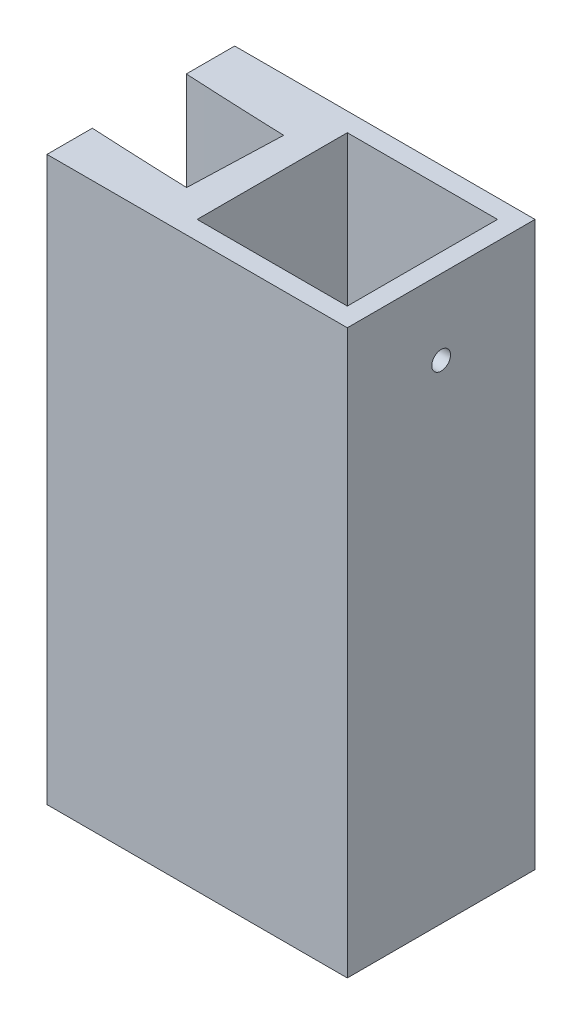
ISO-10303-21;
HEADER;
FILE_DESCRIPTION(('STEP AP214'),'2;1');
FILE_NAME('part.step','',(''),(''),'','','');
FILE_SCHEMA(('AUTOMOTIVE_DESIGN { 1 0 10303 214 1 1 1 1 }'));
ENDSEC;
DATA;
#1=APPLICATION_CONTEXT('core data for automotive mechanical design processes');
#2=APPLICATION_PROTOCOL_DEFINITION('international standard','automotive_design',2000,#1);
#3=PRODUCT_CONTEXT('',#1,'mechanical');
#4=PRODUCT('Part','Part','',(#3));
#5=PRODUCT_RELATED_PRODUCT_CATEGORY('part','',(#4));
#6=PRODUCT_DEFINITION_FORMATION('','',#4);
#7=PRODUCT_DEFINITION_CONTEXT('part definition',#1,'design');
#8=PRODUCT_DEFINITION('design','',#6,#7);
#9=PRODUCT_DEFINITION_SHAPE('','',#8);
#10=(LENGTH_UNIT() NAMED_UNIT(*) SI_UNIT(.MILLI.,.METRE.));
#11=(NAMED_UNIT(*) PLANE_ANGLE_UNIT() SI_UNIT($,.RADIAN.));
#12=(NAMED_UNIT(*) SI_UNIT($,.STERADIAN.) SOLID_ANGLE_UNIT());
#13=UNCERTAINTY_MEASURE_WITH_UNIT(LENGTH_MEASURE(1.E-05),#10,'distance_accuracy_value','');
#14=(GEOMETRIC_REPRESENTATION_CONTEXT(3) GLOBAL_UNCERTAINTY_ASSIGNED_CONTEXT((#13)) GLOBAL_UNIT_ASSIGNED_CONTEXT((#10,
#11,#12)) REPRESENTATION_CONTEXT('',''));
#15=CARTESIAN_POINT('',(0.,0.,0.));
#16=DIRECTION('',(0.,0.,1.));
#17=DIRECTION('',(1.,0.,0.));
#18=AXIS2_PLACEMENT_3D('',#15,#16,#17);
#19=CARTESIAN_POINT('',(-55.,150.,0.));
#20=DIRECTION('',(1.,0.,0.));
#21=DIRECTION('',(0.,0.,-1.));
#22=AXIS2_PLACEMENT_3D('',#19,#20,#21);
#23=PLANE('',#22);
#24=DIRECTION('',(0.,0.,1.));
#25=VECTOR('',#24,1.);
#26=CARTESIAN_POINT('',(-55.,0.,0.));
#27=LINE('',#26,#25);
#28=CARTESIAN_POINT('',(-55.,0.,-25.));
#29=VERTEX_POINT('',#28);
#30=CARTESIAN_POINT('',(-55.,0.,-12.1136856987565));
#31=VERTEX_POINT('',#30);
#32=EDGE_CURVE('E141',#29,#31,#27,.T.);
#33=ORIENTED_EDGE('',*,*,#32,.T.);
#34=DIRECTION('',(0.,1.,0.));
#35=VECTOR('',#34,1.);
#36=CARTESIAN_POINT('',(-55.,-0.001000000000001,-12.1136856987565));
#37=LINE('',#36,#35);
#38=CARTESIAN_POINT('',(-55.,150.,-12.1136856987565));
#39=VERTEX_POINT('',#38);
#40=EDGE_CURVE('E124',#31,#39,#37,.T.);
#41=ORIENTED_EDGE('',*,*,#40,.T.);
#42=DIRECTION('',(0.,0.,1.));
#43=VECTOR('',#42,1.);
#44=CARTESIAN_POINT('',(-55.,150.,0.));
#45=LINE('',#44,#43);
#46=CARTESIAN_POINT('',(-55.,150.,-25.));
#47=VERTEX_POINT('',#46);
#48=EDGE_CURVE('E160',#47,#39,#45,.T.);
#49=ORIENTED_EDGE('',*,*,#48,.F.);
#50=DIRECTION('',(0.,-1.,0.));
#51=VECTOR('',#50,1.);
#52=CARTESIAN_POINT('',(-55.,150.,-25.));
#53=LINE('',#52,#51);
#54=EDGE_CURVE('E146',#47,#29,#53,.T.);
#55=ORIENTED_EDGE('',*,*,#54,.T.);
#56=EDGE_LOOP('',(#33,#41,#49,#55));
#57=FACE_BOUND('',#56,.T.);
#58=ADVANCED_FACE('F36',(#57),#23,.F.);
#59=CARTESIAN_POINT('',(0.,150.,25.));
#60=DIRECTION('',(0.,0.,1.));
#61=DIRECTION('',(1.,0.,0.));
#62=AXIS2_PLACEMENT_3D('',#59,#60,#61);
#63=PLANE('',#62);
#64=DIRECTION('',(-1.,0.,0.));
#65=VECTOR('',#64,1.);
#66=CARTESIAN_POINT('',(0.,0.,25.));
#67=LINE('',#66,#65);
#68=CARTESIAN_POINT('',(25.,0.,25.));
#69=VERTEX_POINT('',#68);
#70=CARTESIAN_POINT('',(-55.,0.,25.));
#71=VERTEX_POINT('',#70);
#72=EDGE_CURVE('E174',#69,#71,#67,.T.);
#73=ORIENTED_EDGE('',*,*,#72,.F.);
#74=DIRECTION('',(0.,-1.,0.));
#75=VECTOR('',#74,1.);
#76=CARTESIAN_POINT('',(25.,150.,25.));
#77=LINE('',#76,#75);
#78=CARTESIAN_POINT('',(25.,150.,25.));
#79=VERTEX_POINT('',#78);
#80=EDGE_CURVE('E11',#79,#69,#77,.T.);
#81=ORIENTED_EDGE('',*,*,#80,.F.);
#82=DIRECTION('',(-1.,0.,0.));
#83=VECTOR('',#82,1.);
#84=CARTESIAN_POINT('',(0.,150.,25.));
#85=LINE('',#84,#83);
#86=CARTESIAN_POINT('',(-55.,150.,25.));
#87=VERTEX_POINT('',#86);
#88=EDGE_CURVE('E147',#79,#87,#85,.T.);
#89=ORIENTED_EDGE('',*,*,#88,.T.);
#90=DIRECTION('',(0.,-1.,0.));
#91=VECTOR('',#90,1.);
#92=CARTESIAN_POINT('',(-55.,150.,25.));
#93=LINE('',#92,#91);
#94=EDGE_CURVE('E157',#87,#71,#93,.T.);
#95=ORIENTED_EDGE('',*,*,#94,.T.);
#96=EDGE_LOOP('',(#73,#81,#89,#95));
#97=FACE_BOUND('',#96,.T.);
#98=ADVANCED_FACE('F38',(#97),#63,.T.);
#99=CARTESIAN_POINT('',(25.,150.,0.));
#100=DIRECTION('',(1.,0.,0.));
#101=DIRECTION('',(0.,0.,-1.));
#102=AXIS2_PLACEMENT_3D('',#99,#100,#101);
#103=PLANE('',#102);
#104=CARTESIAN_POINT('',(25.,130.,0.));
#105=DIRECTION('',(1.,0.,0.));
#106=DIRECTION('',(0.,0.,-1.));
#107=AXIS2_PLACEMENT_3D('',#104,#105,#106);
#108=CIRCLE('',#107,2.5);
#109=CARTESIAN_POINT('',(25.,130.,-2.50000000000001));
#110=VERTEX_POINT('',#109);
#111=EDGE_CURVE('E223',#110,#110,#108,.T.);
#112=ORIENTED_EDGE('',*,*,#111,.F.);
#113=EDGE_LOOP('',(#112));
#114=FACE_BOUND('',#113,.T.);
#115=DIRECTION('',(0.,0.,1.));
#116=VECTOR('',#115,1.);
#117=CARTESIAN_POINT('',(25.,0.,0.));
#118=LINE('',#117,#116);
#119=CARTESIAN_POINT('',(25.,0.,-25.));
#120=VERTEX_POINT('',#119);
#121=EDGE_CURVE('E171',#120,#69,#118,.T.);
#122=ORIENTED_EDGE('',*,*,#121,.F.);
#123=DIRECTION('',(0.,-1.,0.));
#124=VECTOR('',#123,1.);
#125=CARTESIAN_POINT('',(25.,150.,-25.));
#126=LINE('',#125,#124);
#127=CARTESIAN_POINT('',(25.,150.,-25.));
#128=VERTEX_POINT('',#127);
#129=EDGE_CURVE('E44',#128,#120,#126,.T.);
#130=ORIENTED_EDGE('',*,*,#129,.F.);
#131=DIRECTION('',(0.,0.,1.));
#132=VECTOR('',#131,1.);
#133=CARTESIAN_POINT('',(25.,150.,0.));
#134=LINE('',#133,#132);
#135=EDGE_CURVE('E151',#128,#79,#134,.T.);
#136=ORIENTED_EDGE('',*,*,#135,.T.);
#137=ORIENTED_EDGE('',*,*,#80,.T.);
#138=EDGE_LOOP('',(#122,#130,#136,#137));
#139=FACE_BOUND('',#138,.T.);
#140=ADVANCED_FACE('F172',(#114,#139),#103,.T.);
#141=CARTESIAN_POINT('',(0.,150.,-25.));
#142=DIRECTION('',(0.,0.,1.));
#143=DIRECTION('',(1.,0.,0.));
#144=AXIS2_PLACEMENT_3D('',#141,#142,#143);
#145=PLANE('',#144);
#146=DIRECTION('',(-1.,0.,0.));
#147=VECTOR('',#146,1.);
#148=CARTESIAN_POINT('',(0.,0.,-25.));
#149=LINE('',#148,#147);
#150=EDGE_CURVE('E153',#120,#29,#149,.T.);
#151=ORIENTED_EDGE('',*,*,#150,.T.);
#152=ORIENTED_EDGE('',*,*,#54,.F.);
#153=DIRECTION('',(-1.,0.,0.));
#154=VECTOR('',#153,1.);
#155=CARTESIAN_POINT('',(0.,150.,-25.));
#156=LINE('',#155,#154);
#157=EDGE_CURVE('E164',#128,#47,#156,.T.);
#158=ORIENTED_EDGE('',*,*,#157,.F.);
#159=ORIENTED_EDGE('',*,*,#129,.T.);
#160=EDGE_LOOP('',(#151,#152,#158,#159));
#161=FACE_BOUND('',#160,.T.);
#162=ADVANCED_FACE('F163',(#161),#145,.F.);
#163=CARTESIAN_POINT('',(-55.0000000000003,150.,12.9206741571568));
#164=VERTEX_POINT('',#163);
#165=EDGE_CURVE('E179',#164,#87,#45,.T.);
#166=ORIENTED_EDGE('',*,*,#165,.F.);
#167=DIRECTION('',(0.,1.,0.));
#168=VECTOR('',#167,1.);
#169=CARTESIAN_POINT('',(-55.0000000000003,-0.001000000000001,12.9206741571568));
#170=LINE('',#169,#168);
#171=CARTESIAN_POINT('',(-55.0000000000003,0.,12.9206741571568));
#172=VERTEX_POINT('',#171);
#173=EDGE_CURVE('E134',#172,#164,#170,.T.);
#174=ORIENTED_EDGE('',*,*,#173,.F.);
#175=EDGE_CURVE('E148',#172,#71,#27,.T.);
#176=ORIENTED_EDGE('',*,*,#175,.T.);
#177=ORIENTED_EDGE('',*,*,#94,.F.);
#178=EDGE_LOOP('',(#166,#174,#176,#177));
#179=FACE_BOUND('',#178,.T.);
#180=ADVANCED_FACE('F246',(#179),#23,.F.);
#181=CARTESIAN_POINT('',(0.,150.,0.));
#182=DIRECTION('',(0.,1.,0.));
#183=DIRECTION('',(0.,0.,1.));
#184=AXIS2_PLACEMENT_3D('',#181,#182,#183);
#185=PLANE('',#184);
#186=CARTESIAN_POINT('',(24.999999999988,150.,-1525.));
#187=DIRECTION('',(0.,-1.,0.));
#188=DIRECTION('',(0.,0.,1.));
#189=AXIS2_PLACEMENT_3D('',#186,#187,#188);
#190=CIRCLE('',#189,1515.);
#191=CARTESIAN_POINT('',(-27.8727375043363,150.,-10.9228970660713));
#192=VERTEX_POINT('',#191);
#193=EDGE_CURVE('E129',#192,#39,#190,.T.);
#194=ORIENTED_EDGE('',*,*,#193,.F.);
#195=DIRECTION('',(0.0348994967025245,0.,-0.999390827019095));
#196=VECTOR('',#195,1.);
#197=CARTESIAN_POINT('',(-28.7452249218995,150.,14.0618736094071));
#198=LINE('',#197,#196);
#199=CARTESIAN_POINT('',(-28.7452249218995,150.,14.0618736094071));
#200=VERTEX_POINT('',#199);
#201=EDGE_CURVE('E135',#200,#192,#198,.T.);
#202=ORIENTED_EDGE('',*,*,#201,.F.);
#203=CARTESIAN_POINT('',(24.999999999988,150.,-1525.));
#204=DIRECTION('',(0.,1.,0.));
#205=DIRECTION('',(0.,0.,1.));
#206=AXIS2_PLACEMENT_3D('',#203,#204,#205);
#207=CIRCLE('',#206,1540.);
#208=EDGE_CURVE('E233',#164,#200,#207,.T.);
#209=ORIENTED_EDGE('',*,*,#208,.F.);
#210=ORIENTED_EDGE('',*,*,#165,.T.);
#211=ORIENTED_EDGE('',*,*,#88,.F.);
#212=ORIENTED_EDGE('',*,*,#135,.F.);
#213=ORIENTED_EDGE('',*,*,#157,.T.);
#214=ORIENTED_EDGE('',*,*,#48,.T.);
#215=EDGE_LOOP('',(#194,#202,#209,#210,#211,#212,#213,#214));
#216=FACE_BOUND('',#215,.T.);
#217=DIRECTION('',(0.,0.,-1.));
#218=VECTOR('',#217,1.);
#219=CARTESIAN_POINT('',(20.,150.,-20.));
#220=LINE('',#219,#218);
#221=CARTESIAN_POINT('',(20.,150.,20.));
#222=VERTEX_POINT('',#221);
#223=CARTESIAN_POINT('',(20.,150.,-20.));
#224=VERTEX_POINT('',#223);
#225=EDGE_CURVE('E59',#222,#224,#220,.T.);
#226=ORIENTED_EDGE('',*,*,#225,.F.);
#227=DIRECTION('',(1.,0.,0.));
#228=VECTOR('',#227,1.);
#229=CARTESIAN_POINT('',(-20.,150.,20.));
#230=LINE('',#229,#228);
#231=CARTESIAN_POINT('',(-20.,150.,20.));
#232=VERTEX_POINT('',#231);
#233=EDGE_CURVE('E199',#232,#222,#230,.T.);
#234=ORIENTED_EDGE('',*,*,#233,.F.);
#235=DIRECTION('',(0.,0.,1.));
#236=VECTOR('',#235,1.);
#237=CARTESIAN_POINT('',(-20.,150.,-20.));
#238=LINE('',#237,#236);
#239=CARTESIAN_POINT('',(-20.,150.,-20.));
#240=VERTEX_POINT('',#239);
#241=EDGE_CURVE('E203',#240,#232,#238,.T.);
#242=ORIENTED_EDGE('',*,*,#241,.F.);
#243=DIRECTION('',(-1.,0.,0.));
#244=VECTOR('',#243,1.);
#245=CARTESIAN_POINT('',(-20.,150.,-20.));
#246=LINE('',#245,#244);
#247=EDGE_CURVE('E206',#224,#240,#246,.T.);
#248=ORIENTED_EDGE('',*,*,#247,.F.);
#249=EDGE_LOOP('',(#226,#234,#242,#248));
#250=FACE_BOUND('',#249,.T.);
#251=ADVANCED_FACE('F251',(#216,#250),#185,.T.);
#252=CARTESIAN_POINT('',(0.,0.,0.));
#253=DIRECTION('',(0.,1.,0.));
#254=DIRECTION('',(0.,0.,1.));
#255=AXIS2_PLACEMENT_3D('',#252,#253,#254);
#256=PLANE('',#255);
#257=CARTESIAN_POINT('',(0.,0.,0.));
#258=DIRECTION('',(0.,-1.,0.));
#259=DIRECTION('',(0.,0.,-1.));
#260=AXIS2_PLACEMENT_3D('',#257,#258,#259);
#261=CIRCLE('',#260,13.6824088833462);
#262=CARTESIAN_POINT('',(0.,0.,-13.6824088833462));
#263=VERTEX_POINT('',#262);
#264=EDGE_CURVE('E187',#263,#263,#261,.T.);
#265=ORIENTED_EDGE('',*,*,#264,.F.);
#266=EDGE_LOOP('',(#265));
#267=FACE_BOUND('',#266,.T.);
#268=DIRECTION('',(-0.0348994967025245,0.,0.999390827019095));
#269=VECTOR('',#268,1.);
#270=CARTESIAN_POINT('',(-28.7452249218995,0.,14.0618736094071));
#271=LINE('',#270,#269);
#272=CARTESIAN_POINT('',(-27.8727375043363,0.,-10.9228970660713));
#273=VERTEX_POINT('',#272);
#274=CARTESIAN_POINT('',(-28.7452249218995,0.,14.0618736094067));
#275=VERTEX_POINT('',#274);
#276=EDGE_CURVE('E51',#273,#275,#271,.T.);
#277=ORIENTED_EDGE('',*,*,#276,.F.);
#278=CARTESIAN_POINT('',(24.999999999988,0.,-1525.));
#279=DIRECTION('',(0.,1.,0.));
#280=DIRECTION('',(0.,0.,1.));
#281=AXIS2_PLACEMENT_3D('',#278,#279,#280);
#282=CIRCLE('',#281,1515.);
#283=EDGE_CURVE('E127',#31,#273,#282,.T.);
#284=ORIENTED_EDGE('',*,*,#283,.F.);
#285=ORIENTED_EDGE('',*,*,#32,.F.);
#286=ORIENTED_EDGE('',*,*,#150,.F.);
#287=ORIENTED_EDGE('',*,*,#121,.T.);
#288=ORIENTED_EDGE('',*,*,#72,.T.);
#289=ORIENTED_EDGE('',*,*,#175,.F.);
#290=CARTESIAN_POINT('',(24.999999999988,0.,-1525.));
#291=DIRECTION('',(0.,1.,0.));
#292=DIRECTION('',(0.,0.,1.));
#293=AXIS2_PLACEMENT_3D('',#290,#291,#292);
#294=CIRCLE('',#293,1540.);
#295=EDGE_CURVE('E238',#275,#172,#294,.F.);
#296=ORIENTED_EDGE('',*,*,#295,.F.);
#297=EDGE_LOOP('',(#277,#284,#285,#286,#287,#288,#289,#296));
#298=FACE_BOUND('',#297,.T.);
#299=ADVANCED_FACE('F139',(#267,#298),#256,.F.);
#300=CARTESIAN_POINT('',(0.,100.,0.));
#301=DIRECTION('',(0.,-1.,0.));
#302=DIRECTION('',(0.,0.,-1.));
#303=AXIS2_PLACEMENT_3D('',#300,#301,#302);
#304=PLANE('',#303);
#305=CARTESIAN_POINT('',(0.,100.,0.));
#306=DIRECTION('',(0.,-1.,0.));
#307=DIRECTION('',(0.,0.,-1.));
#308=AXIS2_PLACEMENT_3D('',#305,#306,#307);
#309=CIRCLE('',#308,5.);
#310=CARTESIAN_POINT('',(0.,100.,-5.));
#311=VERTEX_POINT('',#310);
#312=EDGE_CURVE('E175',#311,#311,#309,.T.);
#313=ORIENTED_EDGE('',*,*,#312,.T.);
#314=EDGE_LOOP('',(#313));
#315=FACE_BOUND('',#314,.T.);
#316=ADVANCED_FACE('F319',(#315),#304,.T.);
#317=CARTESIAN_POINT('',(0.,100.,0.));
#318=DIRECTION('',(0.,-1.,0.));
#319=DIRECTION('',(0.,0.,-1.));
#320=AXIS2_PLACEMENT_3D('',#317,#318,#319);
#321=CONICAL_SURFACE('',#320,5.,0.174532925199426);
#322=CARTESIAN_POINT('',(0.,50.7596123493895,0.));
#323=DIRECTION('',(0.,-1.,0.));
#324=DIRECTION('',(0.,0.,-1.));
#325=AXIS2_PLACEMENT_3D('',#322,#323,#324);
#326=CIRCLE('',#325,13.6824088833462);
#327=CARTESIAN_POINT('',(0.,50.7596123493895,-13.6824088833462));
#328=VERTEX_POINT('',#327);
#329=EDGE_CURVE('E184',#328,#328,#326,.T.);
#330=ORIENTED_EDGE('',*,*,#329,.T.);
#331=EDGE_LOOP('',(#330));
#332=FACE_BOUND('',#331,.T.);
#333=ORIENTED_EDGE('',*,*,#312,.F.);
#334=EDGE_LOOP('',(#333));
#335=FACE_BOUND('',#334,.T.);
#336=ADVANCED_FACE('F315',(#332,#335),#321,.F.);
#337=CARTESIAN_POINT('',(0.,0.,0.));
#338=DIRECTION('',(0.,-1.,0.));
#339=DIRECTION('',(0.,0.,-1.));
#340=AXIS2_PLACEMENT_3D('',#337,#338,#339);
#341=CYLINDRICAL_SURFACE('',#340,13.6824088833462);
#342=ORIENTED_EDGE('',*,*,#264,.T.);
#343=EDGE_LOOP('',(#342));
#344=FACE_BOUND('',#343,.T.);
#345=ORIENTED_EDGE('',*,*,#329,.F.);
#346=EDGE_LOOP('',(#345));
#347=FACE_BOUND('',#346,.T.);
#348=ADVANCED_FACE('F311',(#344,#347),#341,.F.);
#349=CARTESIAN_POINT('',(20.,110.,-20.));
#350=DIRECTION('',(1.,0.,0.));
#351=DIRECTION('',(0.,0.,-1.));
#352=AXIS2_PLACEMENT_3D('',#349,#350,#351);
#353=PLANE('',#352);
#354=CARTESIAN_POINT('',(20.,130.,0.));
#355=DIRECTION('',(1.,0.,0.));
#356=DIRECTION('',(0.,0.,-1.));
#357=AXIS2_PLACEMENT_3D('',#354,#355,#356);
#358=CIRCLE('',#357,2.5);
#359=CARTESIAN_POINT('',(20.,130.,-2.5));
#360=VERTEX_POINT('',#359);
#361=EDGE_CURVE('E210',#360,#360,#358,.T.);
#362=ORIENTED_EDGE('',*,*,#361,.T.);
#363=EDGE_LOOP('',(#362));
#364=FACE_BOUND('',#363,.T.);
#365=ORIENTED_EDGE('',*,*,#225,.T.);
#366=DIRECTION('',(0.,1.,0.));
#367=VECTOR('',#366,1.);
#368=CARTESIAN_POINT('',(20.,110.,-20.));
#369=LINE('',#368,#367);
#370=CARTESIAN_POINT('',(20.,110.,-20.));
#371=VERTEX_POINT('',#370);
#372=EDGE_CURVE('E191',#371,#224,#369,.T.);
#373=ORIENTED_EDGE('',*,*,#372,.F.);
#374=DIRECTION('',(0.,0.,-1.));
#375=VECTOR('',#374,1.);
#376=CARTESIAN_POINT('',(20.,110.,-20.));
#377=LINE('',#376,#375);
#378=CARTESIAN_POINT('',(20.,110.,20.));
#379=VERTEX_POINT('',#378);
#380=EDGE_CURVE('E202',#379,#371,#377,.T.);
#381=ORIENTED_EDGE('',*,*,#380,.F.);
#382=DIRECTION('',(0.,1.,0.));
#383=VECTOR('',#382,1.);
#384=CARTESIAN_POINT('',(20.,110.,20.));
#385=LINE('',#384,#383);
#386=EDGE_CURVE('E190',#379,#222,#385,.T.);
#387=ORIENTED_EDGE('',*,*,#386,.T.);
#388=EDGE_LOOP('',(#365,#373,#381,#387));
#389=FACE_BOUND('',#388,.T.);
#390=ADVANCED_FACE('F301',(#364,#389),#353,.F.);
#391=CARTESIAN_POINT('',(-20.,110.,20.));
#392=DIRECTION('',(0.,0.,1.));
#393=DIRECTION('',(1.,0.,0.));
#394=AXIS2_PLACEMENT_3D('',#391,#392,#393);
#395=PLANE('',#394);
#396=ORIENTED_EDGE('',*,*,#233,.T.);
#397=ORIENTED_EDGE('',*,*,#386,.F.);
#398=DIRECTION('',(1.,0.,0.));
#399=VECTOR('',#398,1.);
#400=CARTESIAN_POINT('',(-20.,110.,20.));
#401=LINE('',#400,#399);
#402=CARTESIAN_POINT('',(-20.,110.,20.));
#403=VERTEX_POINT('',#402);
#404=EDGE_CURVE('E194',#403,#379,#401,.T.);
#405=ORIENTED_EDGE('',*,*,#404,.F.);
#406=DIRECTION('',(0.,1.,0.));
#407=VECTOR('',#406,1.);
#408=CARTESIAN_POINT('',(-20.,110.,20.));
#409=LINE('',#408,#407);
#410=EDGE_CURVE('E196',#403,#232,#409,.T.);
#411=ORIENTED_EDGE('',*,*,#410,.T.);
#412=EDGE_LOOP('',(#396,#397,#405,#411));
#413=FACE_BOUND('',#412,.T.);
#414=ADVANCED_FACE('F297',(#413),#395,.F.);
#415=CARTESIAN_POINT('',(-20.,110.,-20.));
#416=DIRECTION('',(-1.,0.,0.));
#417=DIRECTION('',(0.,0.,1.));
#418=AXIS2_PLACEMENT_3D('',#415,#416,#417);
#419=PLANE('',#418);
#420=ORIENTED_EDGE('',*,*,#241,.T.);
#421=ORIENTED_EDGE('',*,*,#410,.F.);
#422=DIRECTION('',(0.,0.,1.));
#423=VECTOR('',#422,1.);
#424=CARTESIAN_POINT('',(-20.,110.,-20.));
#425=LINE('',#424,#423);
#426=CARTESIAN_POINT('',(-20.,110.,-20.));
#427=VERTEX_POINT('',#426);
#428=EDGE_CURVE('E213',#427,#403,#425,.T.);
#429=ORIENTED_EDGE('',*,*,#428,.F.);
#430=DIRECTION('',(0.,1.,0.));
#431=VECTOR('',#430,1.);
#432=CARTESIAN_POINT('',(-20.,110.,-20.));
#433=LINE('',#432,#431);
#434=EDGE_CURVE('E193',#427,#240,#433,.T.);
#435=ORIENTED_EDGE('',*,*,#434,.T.);
#436=EDGE_LOOP('',(#420,#421,#429,#435));
#437=FACE_BOUND('',#436,.T.);
#438=ADVANCED_FACE('F300',(#437),#419,.F.);
#439=CARTESIAN_POINT('',(-20.,110.,-20.));
#440=DIRECTION('',(0.,0.,-1.));
#441=DIRECTION('',(-1.,0.,0.));
#442=AXIS2_PLACEMENT_3D('',#439,#440,#441);
#443=PLANE('',#442);
#444=ORIENTED_EDGE('',*,*,#247,.T.);
#445=ORIENTED_EDGE('',*,*,#434,.F.);
#446=DIRECTION('',(-1.,0.,0.));
#447=VECTOR('',#446,1.);
#448=CARTESIAN_POINT('',(-20.,110.,-20.));
#449=LINE('',#448,#447);
#450=EDGE_CURVE('E216',#371,#427,#449,.T.);
#451=ORIENTED_EDGE('',*,*,#450,.F.);
#452=ORIENTED_EDGE('',*,*,#372,.T.);
#453=EDGE_LOOP('',(#444,#445,#451,#452));
#454=FACE_BOUND('',#453,.T.);
#455=ADVANCED_FACE('F292',(#454),#443,.F.);
#456=CARTESIAN_POINT('',(0.,110.,0.));
#457=DIRECTION('',(0.,1.,0.));
#458=DIRECTION('',(0.,0.,1.));
#459=AXIS2_PLACEMENT_3D('',#456,#457,#458);
#460=PLANE('',#459);
#461=ORIENTED_EDGE('',*,*,#380,.T.);
#462=ORIENTED_EDGE('',*,*,#450,.T.);
#463=ORIENTED_EDGE('',*,*,#428,.T.);
#464=ORIENTED_EDGE('',*,*,#404,.T.);
#465=EDGE_LOOP('',(#461,#462,#463,#464));
#466=FACE_BOUND('',#465,.T.);
#467=ADVANCED_FACE('F286',(#466),#460,.T.);
#468=CARTESIAN_POINT('',(25.,130.,0.));
#469=DIRECTION('',(1.,0.,0.));
#470=DIRECTION('',(0.,0.,-1.));
#471=AXIS2_PLACEMENT_3D('',#468,#469,#470);
#472=CYLINDRICAL_SURFACE('',#471,2.5);
#473=ORIENTED_EDGE('',*,*,#361,.F.);
#474=EDGE_LOOP('',(#473));
#475=FACE_BOUND('',#474,.T.);
#476=ORIENTED_EDGE('',*,*,#111,.T.);
#477=EDGE_LOOP('',(#476));
#478=FACE_BOUND('',#477,.T.);
#479=ADVANCED_FACE('F262',(#475,#478),#472,.F.);
#480=CARTESIAN_POINT('',(24.999999999988,-0.001000000000001,-1525.));
#481=DIRECTION('',(0.,1.,0.));
#482=DIRECTION('',(0.,0.,1.));
#483=AXIS2_PLACEMENT_3D('',#480,#481,#482);
#484=CYLINDRICAL_SURFACE('',#483,1515.);
#485=ORIENTED_EDGE('',*,*,#283,.T.);
#486=DIRECTION('',(0.,1.,0.));
#487=VECTOR('',#486,1.);
#488=CARTESIAN_POINT('',(-27.8727375043363,-0.001000000000001,-10.9228970660713));
#489=LINE('',#488,#487);
#490=EDGE_CURVE('E225',#273,#192,#489,.T.);
#491=ORIENTED_EDGE('',*,*,#490,.T.);
#492=ORIENTED_EDGE('',*,*,#193,.T.);
#493=ORIENTED_EDGE('',*,*,#40,.F.);
#494=EDGE_LOOP('',(#485,#491,#492,#493));
#495=FACE_BOUND('',#494,.T.);
#496=ADVANCED_FACE('F126',(#495),#484,.T.);
#497=CARTESIAN_POINT('',(-28.7452249218995,-0.001000000000001,14.0618736094071));
#498=DIRECTION('',(0.999390827019095,0.,0.0348994967025245));
#499=DIRECTION('',(0.0348994967025245,0.,-0.999390827019095));
#500=AXIS2_PLACEMENT_3D('',#497,#498,#499);
#501=PLANE('',#500);
#502=ORIENTED_EDGE('',*,*,#276,.T.);
#503=DIRECTION('',(0.,1.,0.));
#504=VECTOR('',#503,1.);
#505=CARTESIAN_POINT('',(-28.7452249218995,-0.001000000000001,14.0618736094071));
#506=LINE('',#505,#504);
#507=EDGE_CURVE('E228',#275,#200,#506,.T.);
#508=ORIENTED_EDGE('',*,*,#507,.T.);
#509=ORIENTED_EDGE('',*,*,#201,.T.);
#510=ORIENTED_EDGE('',*,*,#490,.F.);
#511=EDGE_LOOP('',(#502,#508,#509,#510));
#512=FACE_BOUND('',#511,.T.);
#513=ADVANCED_FACE('F254',(#512),#501,.F.);
#514=CARTESIAN_POINT('',(24.999999999988,-0.001000000000001,-1525.));
#515=DIRECTION('',(0.,1.,0.));
#516=DIRECTION('',(0.,0.,1.));
#517=AXIS2_PLACEMENT_3D('',#514,#515,#516);
#518=CYLINDRICAL_SURFACE('',#517,1540.);
#519=ORIENTED_EDGE('',*,*,#295,.T.);
#520=ORIENTED_EDGE('',*,*,#173,.T.);
#521=ORIENTED_EDGE('',*,*,#208,.T.);
#522=ORIENTED_EDGE('',*,*,#507,.F.);
#523=EDGE_LOOP('',(#519,#520,#521,#522));
#524=FACE_BOUND('',#523,.T.);
#525=ADVANCED_FACE('F241',(#524),#518,.F.);
#526=CLOSED_SHELL('',(#58,#98,#140,#162,#180,#251,#299,#316,#336,#348,#390,#414,#438,#455,#467,
#479,#496,#513,#525));
#527=MANIFOLD_SOLID_BREP('B2',#526);
#528=ADVANCED_BREP_SHAPE_REPRESENTATION('',(#18,#527),#14);
#529=SHAPE_DEFINITION_REPRESENTATION(#9,#528);
ENDSEC;
END-ISO-10303-21;
